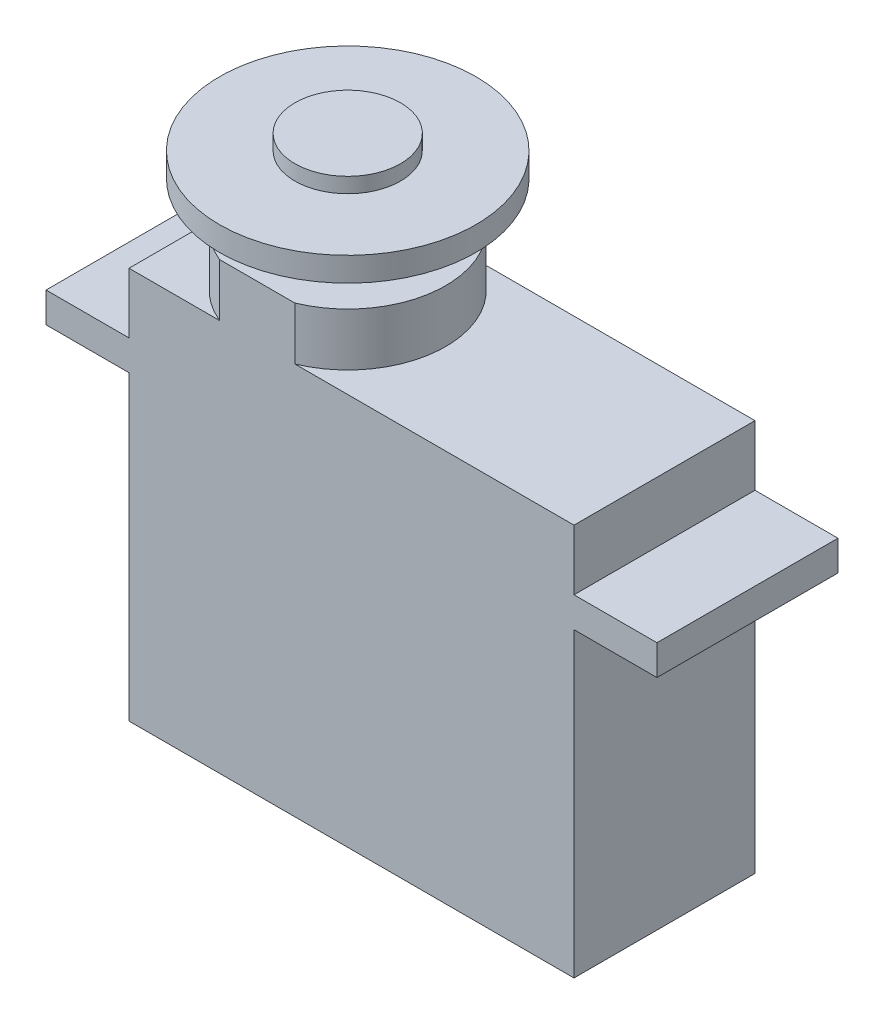
ISO-10303-21;
HEADER;
FILE_DESCRIPTION(('STEP AP214'),'2;1');
FILE_NAME('part.step','',(''),(''),'','','');
FILE_SCHEMA(('AUTOMOTIVE_DESIGN { 1 0 10303 214 1 1 1 1 }'));
ENDSEC;
DATA;
#1=APPLICATION_CONTEXT('core data for automotive mechanical design processes');
#2=APPLICATION_PROTOCOL_DEFINITION('international standard','automotive_design',2000,#1);
#3=PRODUCT_CONTEXT('',#1,'mechanical');
#4=PRODUCT('Part','Part','',(#3));
#5=PRODUCT_RELATED_PRODUCT_CATEGORY('part','',(#4));
#6=PRODUCT_DEFINITION_FORMATION('','',#4);
#7=PRODUCT_DEFINITION_CONTEXT('part definition',#1,'design');
#8=PRODUCT_DEFINITION('design','',#6,#7);
#9=PRODUCT_DEFINITION_SHAPE('','',#8);
#10=(LENGTH_UNIT() NAMED_UNIT(*) SI_UNIT(.MILLI.,.METRE.));
#11=(NAMED_UNIT(*) PLANE_ANGLE_UNIT() SI_UNIT($,.RADIAN.));
#12=(NAMED_UNIT(*) SI_UNIT($,.STERADIAN.) SOLID_ANGLE_UNIT());
#13=UNCERTAINTY_MEASURE_WITH_UNIT(LENGTH_MEASURE(1.E-05),#10,'distance_accuracy_value','');
#14=(GEOMETRIC_REPRESENTATION_CONTEXT(3) GLOBAL_UNCERTAINTY_ASSIGNED_CONTEXT((#13)) GLOBAL_UNIT_ASSIGNED_CONTEXT((#10,
#11,#12)) REPRESENTATION_CONTEXT('',''));
#15=CARTESIAN_POINT('',(0.,0.,0.));
#16=DIRECTION('',(0.,0.,1.));
#17=DIRECTION('',(1.,0.,0.));
#18=AXIS2_PLACEMENT_3D('',#15,#16,#17);
#19=CARTESIAN_POINT('',(-6.5,29.5,0.));
#20=DIRECTION('',(0.,-1.,0.));
#21=DIRECTION('',(0.,0.,-1.));
#22=AXIS2_PLACEMENT_3D('',#19,#20,#21);
#23=PLANE('',#22);
#24=CARTESIAN_POINT('',(0.,29.5,0.));
#25=DIRECTION('',(0.,-1.,0.));
#26=DIRECTION('',(0.,0.,-1.));
#27=AXIS2_PLACEMENT_3D('',#24,#25,#26);
#28=CIRCLE('',#27,4.);
#29=CARTESIAN_POINT('',(0.,29.5,-4.));
#30=VERTEX_POINT('',#29);
#31=EDGE_CURVE('E250',#30,#30,#28,.T.);
#32=ORIENTED_EDGE('',*,*,#31,.T.);
#33=EDGE_LOOP('',(#32));
#34=FACE_BOUND('',#33,.T.);
#35=DIRECTION('',(-1.,0.,0.));
#36=VECTOR('',#35,1.);
#37=CARTESIAN_POINT('',(-6.5,29.5,6.));
#38=LINE('',#37,#36);
#39=CARTESIAN_POINT('',(2.50000000000001,29.5,6.));
#40=VERTEX_POINT('',#39);
#41=CARTESIAN_POINT('',(-2.5,29.5,6.));
#42=VERTEX_POINT('',#41);
#43=EDGE_CURVE('E228',#40,#42,#38,.T.);
#44=ORIENTED_EDGE('',*,*,#43,.F.);
#45=CARTESIAN_POINT('',(0.,29.5,0.));
#46=DIRECTION('',(0.,-1.,0.));
#47=DIRECTION('',(0.,0.,-1.));
#48=AXIS2_PLACEMENT_3D('',#45,#46,#47);
#49=CIRCLE('',#48,6.5);
#50=CARTESIAN_POINT('',(2.49999999999999,29.5,-6.));
#51=VERTEX_POINT('',#50);
#52=EDGE_CURVE('E243',#51,#40,#49,.T.);
#53=ORIENTED_EDGE('',*,*,#52,.F.);
#54=DIRECTION('',(1.,0.,0.));
#55=VECTOR('',#54,1.);
#56=CARTESIAN_POINT('',(-6.5,29.5,-6.));
#57=LINE('',#56,#55);
#58=CARTESIAN_POINT('',(-2.49999999999999,29.5,-6.));
#59=VERTEX_POINT('',#58);
#60=EDGE_CURVE('E246',#59,#51,#57,.T.);
#61=ORIENTED_EDGE('',*,*,#60,.F.);
#62=EDGE_CURVE('E244',#42,#59,#49,.T.);
#63=ORIENTED_EDGE('',*,*,#62,.F.);
#64=EDGE_LOOP('',(#44,#53,#61,#63));
#65=FACE_BOUND('',#64,.T.);
#66=ADVANCED_FACE('F31',(#34,#65),#23,.F.);
#67=CARTESIAN_POINT('',(0.,0.,0.));
#68=DIRECTION('',(0.,-1.,0.));
#69=DIRECTION('',(0.,0.,-1.));
#70=AXIS2_PLACEMENT_3D('',#67,#68,#69);
#71=CYLINDRICAL_SURFACE('',#70,6.5);
#72=DIRECTION('',(0.,-1.,0.));
#73=VECTOR('',#72,1.);
#74=CARTESIAN_POINT('',(-2.50000000000001,0.,6.));
#75=LINE('',#74,#73);
#76=CARTESIAN_POINT('',(-2.5,26.,6.));
#77=VERTEX_POINT('',#76);
#78=EDGE_CURVE('E12',#42,#77,#75,.T.);
#79=ORIENTED_EDGE('',*,*,#78,.F.);
#80=ORIENTED_EDGE('',*,*,#62,.T.);
#81=DIRECTION('',(0.,-1.,0.));
#82=VECTOR('',#81,1.);
#83=CARTESIAN_POINT('',(-2.49999999999999,0.,-6.));
#84=LINE('',#83,#82);
#85=CARTESIAN_POINT('',(-2.5,26.,-6.));
#86=VERTEX_POINT('',#85);
#87=EDGE_CURVE('E46',#86,#59,#84,.F.);
#88=ORIENTED_EDGE('',*,*,#87,.F.);
#89=CARTESIAN_POINT('',(0.,26.,0.));
#90=DIRECTION('',(0.,-1.,0.));
#91=DIRECTION('',(0.,0.,-1.));
#92=AXIS2_PLACEMENT_3D('',#89,#90,#91);
#93=CIRCLE('',#92,6.5);
#94=EDGE_CURVE('E217',#77,#86,#93,.T.);
#95=ORIENTED_EDGE('',*,*,#94,.F.);
#96=EDGE_LOOP('',(#79,#80,#88,#95));
#97=FACE_BOUND('',#96,.T.);
#98=ADVANCED_FACE('F332',(#97),#71,.T.);
#99=DIRECTION('',(0.,-1.,0.));
#100=VECTOR('',#99,1.);
#101=CARTESIAN_POINT('',(2.50000000000001,0.,6.));
#102=LINE('',#101,#100);
#103=CARTESIAN_POINT('',(2.5,26.,6.));
#104=VERTEX_POINT('',#103);
#105=EDGE_CURVE('E39',#104,#40,#102,.F.);
#106=ORIENTED_EDGE('',*,*,#105,.F.);
#107=CARTESIAN_POINT('',(2.5,26.,-6.));
#108=VERTEX_POINT('',#107);
#109=EDGE_CURVE('E245',#108,#104,#93,.T.);
#110=ORIENTED_EDGE('',*,*,#109,.F.);
#111=DIRECTION('',(0.,-1.,0.));
#112=VECTOR('',#111,1.);
#113=CARTESIAN_POINT('',(2.5,0.,-6.));
#114=LINE('',#113,#112);
#115=EDGE_CURVE('E219',#51,#108,#114,.T.);
#116=ORIENTED_EDGE('',*,*,#115,.F.);
#117=ORIENTED_EDGE('',*,*,#52,.T.);
#118=EDGE_LOOP('',(#106,#110,#116,#117));
#119=FACE_BOUND('',#118,.T.);
#120=ADVANCED_FACE('F249',(#119),#71,.T.);
#121=CARTESIAN_POINT('',(20.9999999999999,26.,6.));
#122=DIRECTION('',(0.,-1.,0.));
#123=DIRECTION('',(1.,0.,0.));
#124=AXIS2_PLACEMENT_3D('',#121,#122,#123);
#125=PLANE('',#124);
#126=DIRECTION('',(-1.,0.,0.));
#127=VECTOR('',#126,1.);
#128=CARTESIAN_POINT('',(20.9999999999999,26.,-6.));
#129=LINE('',#128,#127);
#130=CARTESIAN_POINT('',(20.9999999999999,26.,-6.));
#131=VERTEX_POINT('',#130);
#132=EDGE_CURVE('E181',#131,#108,#129,.T.);
#133=ORIENTED_EDGE('',*,*,#132,.T.);
#134=ORIENTED_EDGE('',*,*,#109,.T.);
#135=DIRECTION('',(-1.,0.,0.));
#136=VECTOR('',#135,1.);
#137=CARTESIAN_POINT('',(20.9999999999999,26.,6.));
#138=LINE('',#137,#136);
#139=CARTESIAN_POINT('',(20.9999999999999,26.,6.));
#140=VERTEX_POINT('',#139);
#141=EDGE_CURVE('E231',#140,#104,#138,.T.);
#142=ORIENTED_EDGE('',*,*,#141,.F.);
#143=DIRECTION('',(0.,0.,-1.));
#144=VECTOR('',#143,1.);
#145=CARTESIAN_POINT('',(20.9999999999999,26.,6.));
#146=LINE('',#145,#144);
#147=EDGE_CURVE('E197',#140,#131,#146,.T.);
#148=ORIENTED_EDGE('',*,*,#147,.T.);
#149=EDGE_LOOP('',(#133,#134,#142,#148));
#150=FACE_BOUND('',#149,.T.);
#151=ADVANCED_FACE('F327',(#150),#125,.F.);
#152=CARTESIAN_POINT('',(-8.50000000000002,20.,6.));
#153=DIRECTION('',(1.,0.,0.));
#154=DIRECTION('',(0.,1.,0.));
#155=AXIS2_PLACEMENT_3D('',#152,#153,#154);
#156=PLANE('',#155);
#157=DIRECTION('',(0.,-1.,0.));
#158=VECTOR('',#157,1.);
#159=CARTESIAN_POINT('',(-8.50000000000002,20.,-6.));
#160=LINE('',#159,#158);
#161=CARTESIAN_POINT('',(-8.50000000000002,20.,-6.));
#162=VERTEX_POINT('',#161);
#163=CARTESIAN_POINT('',(-8.50000000000002,0.,-6.));
#164=VERTEX_POINT('',#163);
#165=EDGE_CURVE('E164',#162,#164,#160,.T.);
#166=ORIENTED_EDGE('',*,*,#165,.T.);
#167=DIRECTION('',(0.,0.,-1.));
#168=VECTOR('',#167,1.);
#169=CARTESIAN_POINT('',(-8.50000000000002,0.,6.));
#170=LINE('',#169,#168);
#171=CARTESIAN_POINT('',(-8.50000000000002,0.,6.));
#172=VERTEX_POINT('',#171);
#173=EDGE_CURVE('E215',#172,#164,#170,.T.);
#174=ORIENTED_EDGE('',*,*,#173,.F.);
#175=DIRECTION('',(0.,-1.,0.));
#176=VECTOR('',#175,1.);
#177=CARTESIAN_POINT('',(-8.50000000000002,20.,6.));
#178=LINE('',#177,#176);
#179=CARTESIAN_POINT('',(-8.50000000000002,20.,6.));
#180=VERTEX_POINT('',#179);
#181=EDGE_CURVE('E190',#180,#172,#178,.T.);
#182=ORIENTED_EDGE('',*,*,#181,.F.);
#183=DIRECTION('',(0.,0.,-1.));
#184=VECTOR('',#183,1.);
#185=CARTESIAN_POINT('',(-8.50000000000002,20.,6.));
#186=LINE('',#185,#184);
#187=EDGE_CURVE('E160',#180,#162,#186,.T.);
#188=ORIENTED_EDGE('',*,*,#187,.T.);
#189=EDGE_LOOP('',(#166,#174,#182,#188));
#190=FACE_BOUND('',#189,.T.);
#191=ADVANCED_FACE('F33',(#190),#156,.F.);
#192=CARTESIAN_POINT('',(-8.50000000000002,0.,6.));
#193=DIRECTION('',(0.,1.,0.));
#194=DIRECTION('',(0.,0.,1.));
#195=AXIS2_PLACEMENT_3D('',#192,#193,#194);
#196=PLANE('',#195);
#197=DIRECTION('',(1.,0.,0.));
#198=VECTOR('',#197,1.);
#199=CARTESIAN_POINT('',(-8.50000000000002,0.,-6.));
#200=LINE('',#199,#198);
#201=CARTESIAN_POINT('',(20.9999999999999,0.,-6.));
#202=VERTEX_POINT('',#201);
#203=EDGE_CURVE('E167',#164,#202,#200,.T.);
#204=ORIENTED_EDGE('',*,*,#203,.T.);
#205=DIRECTION('',(0.,0.,-1.));
#206=VECTOR('',#205,1.);
#207=CARTESIAN_POINT('',(20.9999999999999,0.,6.));
#208=LINE('',#207,#206);
#209=CARTESIAN_POINT('',(20.9999999999999,0.,6.));
#210=VERTEX_POINT('',#209);
#211=EDGE_CURVE('E212',#210,#202,#208,.T.);
#212=ORIENTED_EDGE('',*,*,#211,.F.);
#213=DIRECTION('',(1.,0.,0.));
#214=VECTOR('',#213,1.);
#215=CARTESIAN_POINT('',(-8.50000000000002,0.,6.));
#216=LINE('',#215,#214);
#217=EDGE_CURVE('E109',#172,#210,#216,.T.);
#218=ORIENTED_EDGE('',*,*,#217,.F.);
#219=ORIENTED_EDGE('',*,*,#173,.T.);
#220=EDGE_LOOP('',(#204,#212,#218,#219));
#221=FACE_BOUND('',#220,.T.);
#222=ADVANCED_FACE('F301',(#221),#196,.F.);
#223=CARTESIAN_POINT('',(20.9999999999999,0.,6.));
#224=DIRECTION('',(-1.,0.,0.));
#225=DIRECTION('',(0.,-1.,0.));
#226=AXIS2_PLACEMENT_3D('',#223,#224,#225);
#227=PLANE('',#226);
#228=DIRECTION('',(0.,1.,0.));
#229=VECTOR('',#228,1.);
#230=CARTESIAN_POINT('',(20.9999999999999,0.,-6.));
#231=LINE('',#230,#229);
#232=CARTESIAN_POINT('',(20.9999999999999,20.,-6.));
#233=VERTEX_POINT('',#232);
#234=EDGE_CURVE('E170',#202,#233,#231,.T.);
#235=ORIENTED_EDGE('',*,*,#234,.T.);
#236=DIRECTION('',(0.,0.,-1.));
#237=VECTOR('',#236,1.);
#238=CARTESIAN_POINT('',(20.9999999999999,20.,6.));
#239=LINE('',#238,#237);
#240=CARTESIAN_POINT('',(20.9999999999999,20.,6.));
#241=VERTEX_POINT('',#240);
#242=EDGE_CURVE('E209',#241,#233,#239,.T.);
#243=ORIENTED_EDGE('',*,*,#242,.F.);
#244=DIRECTION('',(0.,1.,0.));
#245=VECTOR('',#244,1.);
#246=CARTESIAN_POINT('',(20.9999999999999,0.,6.));
#247=LINE('',#246,#245);
#248=EDGE_CURVE('E272',#210,#241,#247,.T.);
#249=ORIENTED_EDGE('',*,*,#248,.F.);
#250=ORIENTED_EDGE('',*,*,#211,.T.);
#251=EDGE_LOOP('',(#235,#243,#249,#250));
#252=FACE_BOUND('',#251,.T.);
#253=ADVANCED_FACE('F304',(#252),#227,.F.);
#254=CARTESIAN_POINT('',(26.4999999999999,20.,6.));
#255=DIRECTION('',(0.,1.,0.));
#256=DIRECTION('',(0.,0.,1.));
#257=AXIS2_PLACEMENT_3D('',#254,#255,#256);
#258=PLANE('',#257);
#259=DIRECTION('',(1.,0.,0.));
#260=VECTOR('',#259,1.);
#261=CARTESIAN_POINT('',(26.4999999999999,20.,-6.));
#262=LINE('',#261,#260);
#263=CARTESIAN_POINT('',(26.4999999999999,20.,-6.));
#264=VERTEX_POINT('',#263);
#265=EDGE_CURVE('E172',#233,#264,#262,.T.);
#266=ORIENTED_EDGE('',*,*,#265,.T.);
#267=DIRECTION('',(0.,0.,-1.));
#268=VECTOR('',#267,1.);
#269=CARTESIAN_POINT('',(26.4999999999999,20.,6.));
#270=LINE('',#269,#268);
#271=CARTESIAN_POINT('',(26.4999999999999,20.,6.));
#272=VERTEX_POINT('',#271);
#273=EDGE_CURVE('E206',#272,#264,#270,.T.);
#274=ORIENTED_EDGE('',*,*,#273,.F.);
#275=DIRECTION('',(1.,0.,0.));
#276=VECTOR('',#275,1.);
#277=CARTESIAN_POINT('',(26.4999999999999,20.,6.));
#278=LINE('',#277,#276);
#279=EDGE_CURVE('E274',#241,#272,#278,.T.);
#280=ORIENTED_EDGE('',*,*,#279,.F.);
#281=ORIENTED_EDGE('',*,*,#242,.T.);
#282=EDGE_LOOP('',(#266,#274,#280,#281));
#283=FACE_BOUND('',#282,.T.);
#284=ADVANCED_FACE('F309',(#283),#258,.F.);
#285=CARTESIAN_POINT('',(26.4999999999999,20.,6.));
#286=DIRECTION('',(-1.,0.,0.));
#287=DIRECTION('',(0.,0.,1.));
#288=AXIS2_PLACEMENT_3D('',#285,#286,#287);
#289=PLANE('',#288);
#290=DIRECTION('',(0.,1.,0.));
#291=VECTOR('',#290,1.);
#292=CARTESIAN_POINT('',(26.4999999999999,20.,-6.));
#293=LINE('',#292,#291);
#294=CARTESIAN_POINT('',(26.4999999999999,22.,-6.));
#295=VERTEX_POINT('',#294);
#296=EDGE_CURVE('E174',#264,#295,#293,.T.);
#297=ORIENTED_EDGE('',*,*,#296,.T.);
#298=DIRECTION('',(0.,0.,-1.));
#299=VECTOR('',#298,1.);
#300=CARTESIAN_POINT('',(26.4999999999999,22.,6.));
#301=LINE('',#300,#299);
#302=CARTESIAN_POINT('',(26.4999999999999,22.,6.));
#303=VERTEX_POINT('',#302);
#304=EDGE_CURVE('E203',#303,#295,#301,.T.);
#305=ORIENTED_EDGE('',*,*,#304,.F.);
#306=DIRECTION('',(0.,1.,0.));
#307=VECTOR('',#306,1.);
#308=CARTESIAN_POINT('',(26.4999999999999,20.,6.));
#309=LINE('',#308,#307);
#310=EDGE_CURVE('E276',#272,#303,#309,.T.);
#311=ORIENTED_EDGE('',*,*,#310,.F.);
#312=ORIENTED_EDGE('',*,*,#273,.T.);
#313=EDGE_LOOP('',(#297,#305,#311,#312));
#314=FACE_BOUND('',#313,.T.);
#315=ADVANCED_FACE('F315',(#314),#289,.F.);
#316=CARTESIAN_POINT('',(26.4999999999999,22.,6.));
#317=DIRECTION('',(0.,-1.,0.));
#318=DIRECTION('',(1.,0.,0.));
#319=AXIS2_PLACEMENT_3D('',#316,#317,#318);
#320=PLANE('',#319);
#321=DIRECTION('',(-1.,0.,0.));
#322=VECTOR('',#321,1.);
#323=CARTESIAN_POINT('',(26.4999999999999,22.,-6.));
#324=LINE('',#323,#322);
#325=CARTESIAN_POINT('',(20.9999999999999,22.,-6.));
#326=VERTEX_POINT('',#325);
#327=EDGE_CURVE('E176',#295,#326,#324,.T.);
#328=ORIENTED_EDGE('',*,*,#327,.T.);
#329=DIRECTION('',(0.,0.,-1.));
#330=VECTOR('',#329,1.);
#331=CARTESIAN_POINT('',(20.9999999999999,22.,6.));
#332=LINE('',#331,#330);
#333=CARTESIAN_POINT('',(20.9999999999999,22.,6.));
#334=VERTEX_POINT('',#333);
#335=EDGE_CURVE('E200',#334,#326,#332,.T.);
#336=ORIENTED_EDGE('',*,*,#335,.F.);
#337=DIRECTION('',(-1.,0.,0.));
#338=VECTOR('',#337,1.);
#339=CARTESIAN_POINT('',(26.4999999999999,22.,6.));
#340=LINE('',#339,#338);
#341=EDGE_CURVE('E278',#303,#334,#340,.T.);
#342=ORIENTED_EDGE('',*,*,#341,.F.);
#343=ORIENTED_EDGE('',*,*,#304,.T.);
#344=EDGE_LOOP('',(#328,#336,#342,#343));
#345=FACE_BOUND('',#344,.T.);
#346=ADVANCED_FACE('F319',(#345),#320,.F.);
#347=CARTESIAN_POINT('',(20.9999999999999,22.,6.));
#348=DIRECTION('',(-1.,0.,0.));
#349=DIRECTION('',(0.,0.,1.));
#350=AXIS2_PLACEMENT_3D('',#347,#348,#349);
#351=PLANE('',#350);
#352=DIRECTION('',(0.,1.,0.));
#353=VECTOR('',#352,1.);
#354=CARTESIAN_POINT('',(20.9999999999999,22.,-6.));
#355=LINE('',#354,#353);
#356=EDGE_CURVE('E178',#326,#131,#355,.T.);
#357=ORIENTED_EDGE('',*,*,#356,.T.);
#358=ORIENTED_EDGE('',*,*,#147,.F.);
#359=DIRECTION('',(0.,1.,0.));
#360=VECTOR('',#359,1.);
#361=CARTESIAN_POINT('',(20.9999999999999,22.,6.));
#362=LINE('',#361,#360);
#363=EDGE_CURVE('E280',#334,#140,#362,.T.);
#364=ORIENTED_EDGE('',*,*,#363,.F.);
#365=ORIENTED_EDGE('',*,*,#335,.T.);
#366=EDGE_LOOP('',(#357,#358,#364,#365));
#367=FACE_BOUND('',#366,.T.);
#368=ADVANCED_FACE('F324',(#367),#351,.F.);
#369=CARTESIAN_POINT('',(-8.50000000000002,26.,6.));
#370=VERTEX_POINT('',#369);
#371=EDGE_CURVE('E282',#77,#370,#138,.T.);
#372=ORIENTED_EDGE('',*,*,#371,.F.);
#373=ORIENTED_EDGE('',*,*,#94,.T.);
#374=CARTESIAN_POINT('',(-8.50000000000002,26.,-6.));
#375=VERTEX_POINT('',#374);
#376=EDGE_CURVE('E180',#86,#375,#129,.T.);
#377=ORIENTED_EDGE('',*,*,#376,.T.);
#378=DIRECTION('',(0.,0.,-1.));
#379=VECTOR('',#378,1.);
#380=CARTESIAN_POINT('',(-8.50000000000002,26.,6.));
#381=LINE('',#380,#379);
#382=EDGE_CURVE('E194',#370,#375,#381,.T.);
#383=ORIENTED_EDGE('',*,*,#382,.F.);
#384=EDGE_LOOP('',(#372,#373,#377,#383));
#385=FACE_BOUND('',#384,.T.);
#386=ADVANCED_FACE('F287',(#385),#125,.F.);
#387=CARTESIAN_POINT('',(-8.50000000000002,26.,6.));
#388=DIRECTION('',(1.,0.,0.));
#389=DIRECTION('',(0.,1.,0.));
#390=AXIS2_PLACEMENT_3D('',#387,#388,#389);
#391=PLANE('',#390);
#392=DIRECTION('',(0.,-1.,0.));
#393=VECTOR('',#392,1.);
#394=CARTESIAN_POINT('',(-8.50000000000002,26.,-6.));
#395=LINE('',#394,#393);
#396=CARTESIAN_POINT('',(-8.50000000000002,22.,-6.));
#397=VERTEX_POINT('',#396);
#398=EDGE_CURVE('E184',#375,#397,#395,.T.);
#399=ORIENTED_EDGE('',*,*,#398,.T.);
#400=DIRECTION('',(0.,0.,-1.));
#401=VECTOR('',#400,1.);
#402=CARTESIAN_POINT('',(-8.50000000000002,22.,6.));
#403=LINE('',#402,#401);
#404=CARTESIAN_POINT('',(-8.50000000000002,22.,6.));
#405=VERTEX_POINT('',#404);
#406=EDGE_CURVE('E155',#405,#397,#403,.T.);
#407=ORIENTED_EDGE('',*,*,#406,.F.);
#408=DIRECTION('',(0.,-1.,0.));
#409=VECTOR('',#408,1.);
#410=CARTESIAN_POINT('',(-8.50000000000002,26.,6.));
#411=LINE('',#410,#409);
#412=EDGE_CURVE('E143',#370,#405,#411,.T.);
#413=ORIENTED_EDGE('',*,*,#412,.F.);
#414=ORIENTED_EDGE('',*,*,#382,.T.);
#415=EDGE_LOOP('',(#399,#407,#413,#414));
#416=FACE_BOUND('',#415,.T.);
#417=ADVANCED_FACE('F291',(#416),#391,.F.);
#418=CARTESIAN_POINT('',(-8.50000000000002,22.,6.));
#419=DIRECTION('',(0.,-1.,0.));
#420=DIRECTION('',(0.,0.,-1.));
#421=AXIS2_PLACEMENT_3D('',#418,#419,#420);
#422=PLANE('',#421);
#423=DIRECTION('',(-1.,0.,0.));
#424=VECTOR('',#423,1.);
#425=CARTESIAN_POINT('',(-8.50000000000002,22.,-6.));
#426=LINE('',#425,#424);
#427=CARTESIAN_POINT('',(-14.,22.,-6.));
#428=VERTEX_POINT('',#427);
#429=EDGE_CURVE('E152',#397,#428,#426,.T.);
#430=ORIENTED_EDGE('',*,*,#429,.T.);
#431=DIRECTION('',(0.,0.,-1.));
#432=VECTOR('',#431,1.);
#433=CARTESIAN_POINT('',(-14.,22.,6.));
#434=LINE('',#433,#432);
#435=CARTESIAN_POINT('',(-14.,22.,6.));
#436=VERTEX_POINT('',#435);
#437=EDGE_CURVE('E149',#436,#428,#434,.T.);
#438=ORIENTED_EDGE('',*,*,#437,.F.);
#439=DIRECTION('',(-1.,0.,0.));
#440=VECTOR('',#439,1.);
#441=CARTESIAN_POINT('',(-8.50000000000002,22.,6.));
#442=LINE('',#441,#440);
#443=EDGE_CURVE('E136',#405,#436,#442,.T.);
#444=ORIENTED_EDGE('',*,*,#443,.F.);
#445=ORIENTED_EDGE('',*,*,#406,.T.);
#446=EDGE_LOOP('',(#430,#438,#444,#445));
#447=FACE_BOUND('',#446,.T.);
#448=ADVANCED_FACE('F150',(#447),#422,.F.);
#449=CARTESIAN_POINT('',(-14.,20.,6.));
#450=DIRECTION('',(1.,0.,0.));
#451=DIRECTION('',(0.,0.,-1.));
#452=AXIS2_PLACEMENT_3D('',#449,#450,#451);
#453=PLANE('',#452);
#454=DIRECTION('',(0.,-1.,0.));
#455=VECTOR('',#454,1.);
#456=CARTESIAN_POINT('',(-14.,20.,-6.));
#457=LINE('',#456,#455);
#458=CARTESIAN_POINT('',(-14.,20.,-6.));
#459=VERTEX_POINT('',#458);
#460=EDGE_CURVE('E187',#428,#459,#457,.T.);
#461=ORIENTED_EDGE('',*,*,#460,.T.);
#462=DIRECTION('',(0.,0.,-1.));
#463=VECTOR('',#462,1.);
#464=CARTESIAN_POINT('',(-14.,20.,6.));
#465=LINE('',#464,#463);
#466=CARTESIAN_POINT('',(-14.,20.,6.));
#467=VERTEX_POINT('',#466);
#468=EDGE_CURVE('E156',#467,#459,#465,.T.);
#469=ORIENTED_EDGE('',*,*,#468,.F.);
#470=DIRECTION('',(0.,-1.,0.));
#471=VECTOR('',#470,1.);
#472=CARTESIAN_POINT('',(-14.,20.,6.));
#473=LINE('',#472,#471);
#474=EDGE_CURVE('E140',#436,#467,#473,.T.);
#475=ORIENTED_EDGE('',*,*,#474,.F.);
#476=ORIENTED_EDGE('',*,*,#437,.T.);
#477=EDGE_LOOP('',(#461,#469,#475,#476));
#478=FACE_BOUND('',#477,.T.);
#479=ADVANCED_FACE('F158',(#478),#453,.F.);
#480=CARTESIAN_POINT('',(-8.50000000000002,20.,6.));
#481=DIRECTION('',(0.,1.,0.));
#482=DIRECTION('',(0.,0.,1.));
#483=AXIS2_PLACEMENT_3D('',#480,#481,#482);
#484=PLANE('',#483);
#485=DIRECTION('',(1.,0.,0.));
#486=VECTOR('',#485,1.);
#487=CARTESIAN_POINT('',(-8.50000000000002,20.,-6.));
#488=LINE('',#487,#486);
#489=EDGE_CURVE('E100',#459,#162,#488,.T.);
#490=ORIENTED_EDGE('',*,*,#489,.T.);
#491=ORIENTED_EDGE('',*,*,#187,.F.);
#492=DIRECTION('',(1.,0.,0.));
#493=VECTOR('',#492,1.);
#494=CARTESIAN_POINT('',(-8.50000000000002,20.,6.));
#495=LINE('',#494,#493);
#496=EDGE_CURVE('E55',#467,#180,#495,.T.);
#497=ORIENTED_EDGE('',*,*,#496,.F.);
#498=ORIENTED_EDGE('',*,*,#468,.T.);
#499=EDGE_LOOP('',(#490,#491,#497,#498));
#500=FACE_BOUND('',#499,.T.);
#501=ADVANCED_FACE('F295',(#500),#484,.F.);
#502=CARTESIAN_POINT('',(-8.50000000000002,0.,6.));
#503=DIRECTION('',(0.,0.,1.));
#504=DIRECTION('',(1.,0.,0.));
#505=AXIS2_PLACEMENT_3D('',#502,#503,#504);
#506=PLANE('',#505);
#507=ORIENTED_EDGE('',*,*,#181,.T.);
#508=ORIENTED_EDGE('',*,*,#217,.T.);
#509=ORIENTED_EDGE('',*,*,#248,.T.);
#510=ORIENTED_EDGE('',*,*,#279,.T.);
#511=ORIENTED_EDGE('',*,*,#310,.T.);
#512=ORIENTED_EDGE('',*,*,#341,.T.);
#513=ORIENTED_EDGE('',*,*,#363,.T.);
#514=ORIENTED_EDGE('',*,*,#141,.T.);
#515=ORIENTED_EDGE('',*,*,#105,.T.);
#516=ORIENTED_EDGE('',*,*,#43,.T.);
#517=ORIENTED_EDGE('',*,*,#78,.T.);
#518=ORIENTED_EDGE('',*,*,#371,.T.);
#519=ORIENTED_EDGE('',*,*,#412,.T.);
#520=ORIENTED_EDGE('',*,*,#443,.T.);
#521=ORIENTED_EDGE('',*,*,#474,.T.);
#522=ORIENTED_EDGE('',*,*,#496,.T.);
#523=EDGE_LOOP('',(#507,#508,#509,#510,#511,#512,#513,#514,#515,#516,#517,#518,#519,#520,#521,#522));
#524=FACE_BOUND('',#523,.T.);
#525=ADVANCED_FACE('F138',(#524),#506,.T.);
#526=CARTESIAN_POINT('',(-8.50000000000002,0.,-6.));
#527=DIRECTION('',(0.,0.,1.));
#528=DIRECTION('',(1.,0.,0.));
#529=AXIS2_PLACEMENT_3D('',#526,#527,#528);
#530=PLANE('',#529);
#531=ORIENTED_EDGE('',*,*,#165,.F.);
#532=ORIENTED_EDGE('',*,*,#489,.F.);
#533=ORIENTED_EDGE('',*,*,#460,.F.);
#534=ORIENTED_EDGE('',*,*,#429,.F.);
#535=ORIENTED_EDGE('',*,*,#398,.F.);
#536=ORIENTED_EDGE('',*,*,#376,.F.);
#537=ORIENTED_EDGE('',*,*,#87,.T.);
#538=ORIENTED_EDGE('',*,*,#60,.T.);
#539=ORIENTED_EDGE('',*,*,#115,.T.);
#540=ORIENTED_EDGE('',*,*,#132,.F.);
#541=ORIENTED_EDGE('',*,*,#356,.F.);
#542=ORIENTED_EDGE('',*,*,#327,.F.);
#543=ORIENTED_EDGE('',*,*,#296,.F.);
#544=ORIENTED_EDGE('',*,*,#265,.F.);
#545=ORIENTED_EDGE('',*,*,#234,.F.);
#546=ORIENTED_EDGE('',*,*,#203,.F.);
#547=EDGE_LOOP('',(#531,#532,#533,#534,#535,#536,#537,#538,#539,#540,#541,#542,#543,#544,#545,#546));
#548=FACE_BOUND('',#547,.T.);
#549=ADVANCED_FACE('F294',(#548),#530,.F.);
#550=CARTESIAN_POINT('',(-3.5,35.,0.));
#551=DIRECTION('',(0.,-1.,0.));
#552=DIRECTION('',(0.,0.,-1.));
#553=AXIS2_PLACEMENT_3D('',#550,#551,#552);
#554=PLANE('',#553);
#555=CARTESIAN_POINT('',(0.,35.,0.));
#556=DIRECTION('',(0.,-1.,0.));
#557=DIRECTION('',(0.,0.,-1.));
#558=AXIS2_PLACEMENT_3D('',#555,#556,#557);
#559=CIRCLE('',#558,3.5);
#560=CARTESIAN_POINT('',(0.,35.,-3.5));
#561=VERTEX_POINT('',#560);
#562=EDGE_CURVE('E168',#561,#561,#559,.T.);
#563=ORIENTED_EDGE('',*,*,#562,.F.);
#564=EDGE_LOOP('',(#563));
#565=FACE_BOUND('',#564,.T.);
#566=ADVANCED_FACE('F364',(#565),#554,.F.);
#567=CARTESIAN_POINT('',(0.,0.,0.));
#568=DIRECTION('',(0.,-1.,0.));
#569=DIRECTION('',(0.,0.,-1.));
#570=AXIS2_PLACEMENT_3D('',#567,#568,#569);
#571=CYLINDRICAL_SURFACE('',#570,3.5);
#572=CARTESIAN_POINT('',(0.,34.,0.));
#573=DIRECTION('',(0.,-1.,0.));
#574=DIRECTION('',(0.,0.,-1.));
#575=AXIS2_PLACEMENT_3D('',#572,#573,#574);
#576=CIRCLE('',#575,3.5);
#577=CARTESIAN_POINT('',(0.,34.,-3.5));
#578=VERTEX_POINT('',#577);
#579=EDGE_CURVE('E265',#578,#578,#576,.T.);
#580=ORIENTED_EDGE('',*,*,#579,.F.);
#581=EDGE_LOOP('',(#580));
#582=FACE_BOUND('',#581,.T.);
#583=ORIENTED_EDGE('',*,*,#562,.T.);
#584=EDGE_LOOP('',(#583));
#585=FACE_BOUND('',#584,.T.);
#586=ADVANCED_FACE('F360',(#582,#585),#571,.T.);
#587=CARTESIAN_POINT('',(-8.5,34.,0.));
#588=DIRECTION('',(0.,-1.,0.));
#589=DIRECTION('',(0.,0.,-1.));
#590=AXIS2_PLACEMENT_3D('',#587,#588,#589);
#591=PLANE('',#590);
#592=CARTESIAN_POINT('',(0.,34.,0.));
#593=DIRECTION('',(0.,-1.,0.));
#594=DIRECTION('',(0.,0.,-1.));
#595=AXIS2_PLACEMENT_3D('',#592,#593,#594);
#596=CIRCLE('',#595,8.5);
#597=CARTESIAN_POINT('',(0.,34.,-8.5));
#598=VERTEX_POINT('',#597);
#599=EDGE_CURVE('E262',#598,#598,#596,.T.);
#600=ORIENTED_EDGE('',*,*,#599,.F.);
#601=EDGE_LOOP('',(#600));
#602=FACE_BOUND('',#601,.T.);
#603=ORIENTED_EDGE('',*,*,#579,.T.);
#604=EDGE_LOOP('',(#603));
#605=FACE_BOUND('',#604,.T.);
#606=ADVANCED_FACE('F356',(#602,#605),#591,.F.);
#607=CARTESIAN_POINT('',(0.,0.,0.));
#608=DIRECTION('',(0.,-1.,0.));
#609=DIRECTION('',(0.,0.,-1.));
#610=AXIS2_PLACEMENT_3D('',#607,#608,#609);
#611=CYLINDRICAL_SURFACE('',#610,8.5);
#612=CARTESIAN_POINT('',(0.,32.4,0.));
#613=DIRECTION('',(0.,-1.,0.));
#614=DIRECTION('',(0.,0.,-1.));
#615=AXIS2_PLACEMENT_3D('',#612,#613,#614);
#616=CIRCLE('',#615,8.5);
#617=CARTESIAN_POINT('',(0.,32.4,-8.5));
#618=VERTEX_POINT('',#617);
#619=EDGE_CURVE('E259',#618,#618,#616,.T.);
#620=ORIENTED_EDGE('',*,*,#619,.F.);
#621=EDGE_LOOP('',(#620));
#622=FACE_BOUND('',#621,.T.);
#623=ORIENTED_EDGE('',*,*,#599,.T.);
#624=EDGE_LOOP('',(#623));
#625=FACE_BOUND('',#624,.T.);
#626=ADVANCED_FACE('F352',(#622,#625),#611,.T.);
#627=CARTESIAN_POINT('',(-4.,32.4,0.));
#628=DIRECTION('',(0.,1.,0.));
#629=DIRECTION('',(0.,0.,1.));
#630=AXIS2_PLACEMENT_3D('',#627,#628,#629);
#631=PLANE('',#630);
#632=ORIENTED_EDGE('',*,*,#619,.T.);
#633=EDGE_LOOP('',(#632));
#634=FACE_BOUND('',#633,.T.);
#635=CARTESIAN_POINT('',(0.,32.4,0.));
#636=DIRECTION('',(0.,-1.,0.));
#637=DIRECTION('',(0.,0.,-1.));
#638=AXIS2_PLACEMENT_3D('',#635,#636,#637);
#639=CIRCLE('',#638,4.);
#640=CARTESIAN_POINT('',(0.,32.4,-4.));
#641=VERTEX_POINT('',#640);
#642=EDGE_CURVE('E253',#641,#641,#639,.T.);
#643=ORIENTED_EDGE('',*,*,#642,.F.);
#644=EDGE_LOOP('',(#643));
#645=FACE_BOUND('',#644,.T.);
#646=ADVANCED_FACE('F348',(#634,#645),#631,.F.);
#647=CARTESIAN_POINT('',(0.,0.,0.));
#648=DIRECTION('',(0.,-1.,0.));
#649=DIRECTION('',(0.,0.,-1.));
#650=AXIS2_PLACEMENT_3D('',#647,#648,#649);
#651=CYLINDRICAL_SURFACE('',#650,4.);
#652=ORIENTED_EDGE('',*,*,#31,.F.);
#653=EDGE_LOOP('',(#652));
#654=FACE_BOUND('',#653,.T.);
#655=ORIENTED_EDGE('',*,*,#642,.T.);
#656=EDGE_LOOP('',(#655));
#657=FACE_BOUND('',#656,.T.);
#658=ADVANCED_FACE('F345',(#654,#657),#651,.T.);
#659=CLOSED_SHELL('',(#66,#98,#120,#151,#191,#222,#253,#284,#315,#346,#368,#386,#417,#448,#479,
#501,#525,#549,#566,#586,#606,#626,#646,#658));
#660=MANIFOLD_SOLID_BREP('B2',#659);
#661=ADVANCED_BREP_SHAPE_REPRESENTATION('',(#18,#660),#14);
#662=SHAPE_DEFINITION_REPRESENTATION(#9,#661);
ENDSEC;
END-ISO-10303-21;
